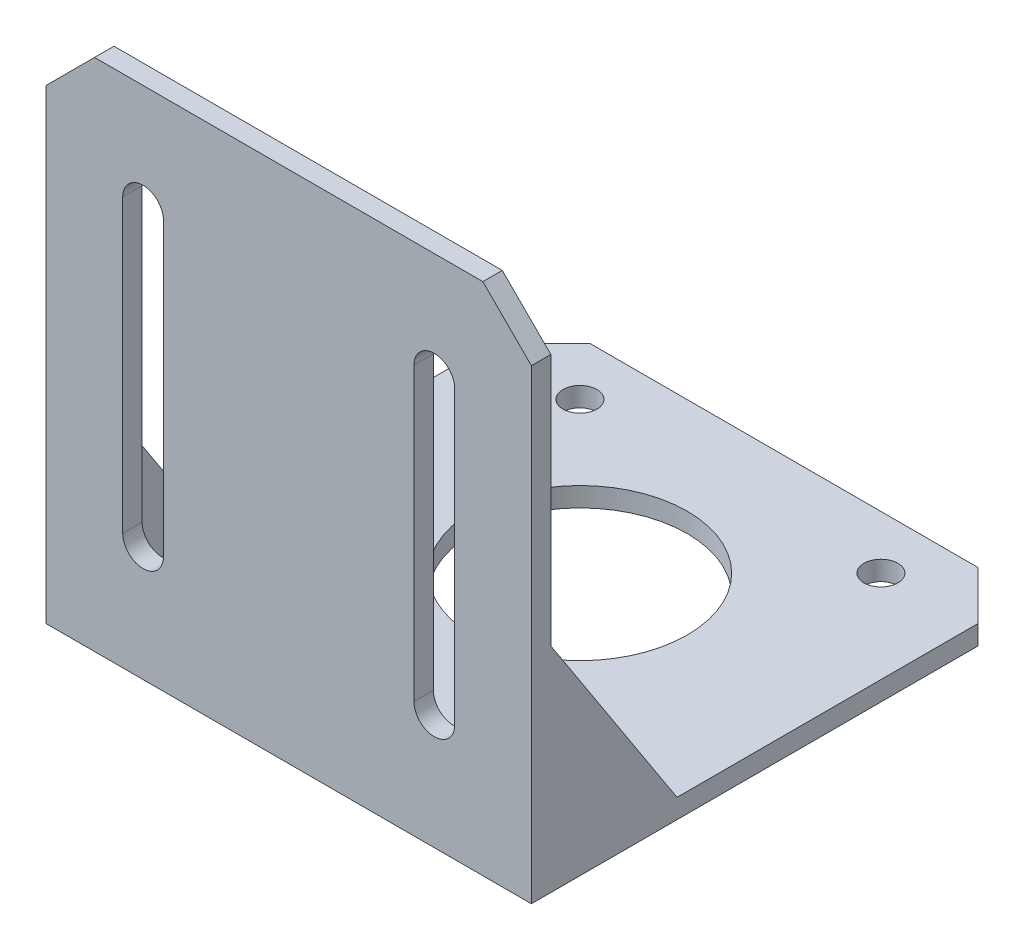
ISO-10303-21;
HEADER;
FILE_DESCRIPTION(('STEP AP214'),'2;1');
FILE_NAME('part.step','',(''),(''),'','','');
FILE_SCHEMA(('AUTOMOTIVE_DESIGN { 1 0 10303 214 1 1 1 1 }'));
ENDSEC;
DATA;
#1=APPLICATION_CONTEXT('core data for automotive mechanical design processes');
#2=APPLICATION_PROTOCOL_DEFINITION('international standard','automotive_design',2000,#1);
#3=PRODUCT_CONTEXT('',#1,'mechanical');
#4=PRODUCT('Part','Part','',(#3));
#5=PRODUCT_RELATED_PRODUCT_CATEGORY('part','',(#4));
#6=PRODUCT_DEFINITION_FORMATION('','',#4);
#7=PRODUCT_DEFINITION_CONTEXT('part definition',#1,'design');
#8=PRODUCT_DEFINITION('design','',#6,#7);
#9=PRODUCT_DEFINITION_SHAPE('','',#8);
#10=(LENGTH_UNIT() NAMED_UNIT(*) SI_UNIT(.MILLI.,.METRE.));
#11=(NAMED_UNIT(*) PLANE_ANGLE_UNIT() SI_UNIT($,.RADIAN.));
#12=(NAMED_UNIT(*) SI_UNIT($,.STERADIAN.) SOLID_ANGLE_UNIT());
#13=UNCERTAINTY_MEASURE_WITH_UNIT(LENGTH_MEASURE(1.E-05),#10,'distance_accuracy_value','');
#14=(GEOMETRIC_REPRESENTATION_CONTEXT(3) GLOBAL_UNCERTAINTY_ASSIGNED_CONTEXT((#13)) GLOBAL_UNIT_ASSIGNED_CONTEXT((#10,
#11,#12)) REPRESENTATION_CONTEXT('',''));
#15=CARTESIAN_POINT('',(0.,0.,0.));
#16=DIRECTION('',(0.,0.,1.));
#17=DIRECTION('',(1.,0.,0.));
#18=AXIS2_PLACEMENT_3D('',#15,#16,#17);
#19=CARTESIAN_POINT('',(-25.,53.,30.));
#20=DIRECTION('',(0.,0.,-1.));
#21=DIRECTION('',(-1.,0.,0.));
#22=AXIS2_PLACEMENT_3D('',#19,#20,#21);
#23=PLANE('',#22);
#24=DIRECTION('',(0.,-1.,0.));
#25=VECTOR('',#24,1.);
#26=CARTESIAN_POINT('',(-25.,53.,30.));
#27=LINE('',#26,#25);
#28=CARTESIAN_POINT('',(-25.,48.,30.));
#29=VERTEX_POINT('',#28);
#30=CARTESIAN_POINT('',(-25.,0.,30.));
#31=VERTEX_POINT('',#30);
#32=EDGE_CURVE('E287',#29,#31,#27,.T.);
#33=ORIENTED_EDGE('',*,*,#32,.T.);
#34=DIRECTION('',(1.,0.,0.));
#35=VECTOR('',#34,1.);
#36=CARTESIAN_POINT('',(-25.,0.,30.));
#37=LINE('',#36,#35);
#38=CARTESIAN_POINT('',(25.,0.,30.));
#39=VERTEX_POINT('',#38);
#40=EDGE_CURVE('E265',#31,#39,#37,.T.);
#41=ORIENTED_EDGE('',*,*,#40,.T.);
#42=DIRECTION('',(0.,-1.,0.));
#43=VECTOR('',#42,1.);
#44=CARTESIAN_POINT('',(25.,53.,30.));
#45=LINE('',#44,#43);
#46=CARTESIAN_POINT('',(25.,48.,30.));
#47=VERTEX_POINT('',#46);
#48=EDGE_CURVE('E284',#47,#39,#45,.T.);
#49=ORIENTED_EDGE('',*,*,#48,.F.);
#50=DIRECTION('',(-0.707106781186547,0.707106781186549,0.));
#51=VECTOR('',#50,1.);
#52=CARTESIAN_POINT('',(20.,53.,30.));
#53=LINE('',#52,#51);
#54=CARTESIAN_POINT('',(20.,53.,30.));
#55=VERTEX_POINT('',#54);
#56=EDGE_CURVE('E365',#47,#55,#53,.T.);
#57=ORIENTED_EDGE('',*,*,#56,.T.);
#58=DIRECTION('',(1.,0.,0.));
#59=VECTOR('',#58,1.);
#60=CARTESIAN_POINT('',(-25.,53.,30.));
#61=LINE('',#60,#59);
#62=CARTESIAN_POINT('',(-20.,53.,30.));
#63=VERTEX_POINT('',#62);
#64=EDGE_CURVE('E273',#63,#55,#61,.T.);
#65=ORIENTED_EDGE('',*,*,#64,.F.);
#66=DIRECTION('',(-0.707106781186547,-0.707106781186549,0.));
#67=VECTOR('',#66,1.);
#68=CARTESIAN_POINT('',(-20.,53.,30.));
#69=LINE('',#68,#67);
#70=EDGE_CURVE('E351',#63,#29,#69,.T.);
#71=ORIENTED_EDGE('',*,*,#70,.T.);
#72=EDGE_LOOP('',(#33,#41,#49,#57,#65,#71));
#73=FACE_BOUND('',#72,.T.);
#74=CARTESIAN_POINT('',(15.,42.,30.));
#75=DIRECTION('',(0.,0.,-1.));
#76=DIRECTION('',(-1.,0.,0.));
#77=AXIS2_PLACEMENT_3D('',#74,#75,#76);
#78=CIRCLE('',#77,2.1);
#79=CARTESIAN_POINT('',(12.9,42.,30.));
#80=VERTEX_POINT('',#79);
#81=CARTESIAN_POINT('',(17.1,42.,30.));
#82=VERTEX_POINT('',#81);
#83=EDGE_CURVE('E258',#80,#82,#78,.T.);
#84=ORIENTED_EDGE('',*,*,#83,.T.);
#85=DIRECTION('',(0.,-1.,0.));
#86=VECTOR('',#85,1.);
#87=CARTESIAN_POINT('',(17.1,0.,30.));
#88=LINE('',#87,#86);
#89=CARTESIAN_POINT('',(17.1,12.,30.));
#90=VERTEX_POINT('',#89);
#91=EDGE_CURVE('E242',#82,#90,#88,.T.);
#92=ORIENTED_EDGE('',*,*,#91,.T.);
#93=CARTESIAN_POINT('',(15.,12.,30.));
#94=DIRECTION('',(0.,0.,-1.));
#95=DIRECTION('',(-1.,0.,0.));
#96=AXIS2_PLACEMENT_3D('',#93,#94,#95);
#97=CIRCLE('',#96,2.1);
#98=CARTESIAN_POINT('',(12.9,12.,30.));
#99=VERTEX_POINT('',#98);
#100=EDGE_CURVE('E252',#90,#99,#97,.T.);
#101=ORIENTED_EDGE('',*,*,#100,.T.);
#102=DIRECTION('',(0.,-1.,0.));
#103=VECTOR('',#102,1.);
#104=CARTESIAN_POINT('',(12.9,0.,30.));
#105=LINE('',#104,#103);
#106=EDGE_CURVE('E255',#80,#99,#105,.T.);
#107=ORIENTED_EDGE('',*,*,#106,.F.);
#108=EDGE_LOOP('',(#84,#92,#101,#107));
#109=FACE_BOUND('',#108,.T.);
#110=CARTESIAN_POINT('',(-15.,12.,30.));
#111=DIRECTION('',(0.,0.,-1.));
#112=DIRECTION('',(-1.,0.,0.));
#113=AXIS2_PLACEMENT_3D('',#110,#111,#112);
#114=CIRCLE('',#113,2.1);
#115=CARTESIAN_POINT('',(-17.1,12.,30.));
#116=VERTEX_POINT('',#115);
#117=CARTESIAN_POINT('',(-12.9,12.,30.));
#118=VERTEX_POINT('',#117);
#119=EDGE_CURVE('E228',#116,#118,#114,.F.);
#120=ORIENTED_EDGE('',*,*,#119,.F.);
#121=DIRECTION('',(0.,-1.,0.));
#122=VECTOR('',#121,1.);
#123=CARTESIAN_POINT('',(-17.1,0.,30.));
#124=LINE('',#123,#122);
#125=CARTESIAN_POINT('',(-17.1,42.,30.));
#126=VERTEX_POINT('',#125);
#127=EDGE_CURVE('E230',#126,#116,#124,.T.);
#128=ORIENTED_EDGE('',*,*,#127,.F.);
#129=CARTESIAN_POINT('',(-15.,42.,30.));
#130=DIRECTION('',(0.,0.,-1.));
#131=DIRECTION('',(-1.,0.,0.));
#132=AXIS2_PLACEMENT_3D('',#129,#130,#131);
#133=CIRCLE('',#132,2.1);
#134=CARTESIAN_POINT('',(-12.9,42.,30.));
#135=VERTEX_POINT('',#134);
#136=EDGE_CURVE('E232',#135,#126,#133,.F.);
#137=ORIENTED_EDGE('',*,*,#136,.F.);
#138=DIRECTION('',(0.,-1.,0.));
#139=VECTOR('',#138,1.);
#140=CARTESIAN_POINT('',(-12.9,0.,30.));
#141=LINE('',#140,#139);
#142=EDGE_CURVE('E235',#135,#118,#141,.T.);
#143=ORIENTED_EDGE('',*,*,#142,.T.);
#144=EDGE_LOOP('',(#120,#128,#137,#143));
#145=FACE_BOUND('',#144,.T.);
#146=ADVANCED_FACE('F36',(#73,#109,#145),#23,.F.);
#147=CARTESIAN_POINT('',(-25.,53.,28.));
#148=DIRECTION('',(0.,0.,1.));
#149=DIRECTION('',(1.,0.,0.));
#150=AXIS2_PLACEMENT_3D('',#147,#148,#149);
#151=PLANE('',#150);
#152=DIRECTION('',(0.,1.,0.));
#153=VECTOR('',#152,1.);
#154=CARTESIAN_POINT('',(23.,53.,28.));
#155=LINE('',#154,#153);
#156=CARTESIAN_POINT('',(23.,4.,28.));
#157=VERTEX_POINT('',#156);
#158=CARTESIAN_POINT('',(23.,22.,28.));
#159=VERTEX_POINT('',#158);
#160=EDGE_CURVE('E226',#157,#159,#155,.T.);
#161=ORIENTED_EDGE('',*,*,#160,.F.);
#162=DIRECTION('',(1.,0.,0.));
#163=VECTOR('',#162,1.);
#164=CARTESIAN_POINT('',(-23.,4.,28.));
#165=LINE('',#164,#163);
#166=CARTESIAN_POINT('',(-23.,4.,28.));
#167=VERTEX_POINT('',#166);
#168=EDGE_CURVE('E44',#157,#167,#165,.F.);
#169=ORIENTED_EDGE('',*,*,#168,.T.);
#170=DIRECTION('',(0.,-1.,0.));
#171=VECTOR('',#170,1.);
#172=CARTESIAN_POINT('',(-23.,53.,28.));
#173=LINE('',#172,#171);
#174=CARTESIAN_POINT('',(-23.,22.,28.));
#175=VERTEX_POINT('',#174);
#176=EDGE_CURVE('E219',#175,#167,#173,.T.);
#177=ORIENTED_EDGE('',*,*,#176,.F.);
#178=DIRECTION('',(-1.,0.,0.));
#179=VECTOR('',#178,1.);
#180=CARTESIAN_POINT('',(-25.,22.,28.));
#181=LINE('',#180,#179);
#182=CARTESIAN_POINT('',(-25.,22.,28.));
#183=VERTEX_POINT('',#182);
#184=EDGE_CURVE('E447',#175,#183,#181,.T.);
#185=ORIENTED_EDGE('',*,*,#184,.T.);
#186=DIRECTION('',(0.,-1.,0.));
#187=VECTOR('',#186,1.);
#188=CARTESIAN_POINT('',(-25.,53.,28.));
#189=LINE('',#188,#187);
#190=CARTESIAN_POINT('',(-25.,48.,28.));
#191=VERTEX_POINT('',#190);
#192=EDGE_CURVE('E278',#191,#183,#189,.T.);
#193=ORIENTED_EDGE('',*,*,#192,.F.);
#194=DIRECTION('',(0.707106781186547,0.707106781186549,0.));
#195=VECTOR('',#194,1.);
#196=CARTESIAN_POINT('',(-20.,53.,28.));
#197=LINE('',#196,#195);
#198=CARTESIAN_POINT('',(-20.,53.,28.));
#199=VERTEX_POINT('',#198);
#200=EDGE_CURVE('E355',#191,#199,#197,.T.);
#201=ORIENTED_EDGE('',*,*,#200,.T.);
#202=DIRECTION('',(-1.,0.,0.));
#203=VECTOR('',#202,1.);
#204=CARTESIAN_POINT('',(-25.,53.,28.));
#205=LINE('',#204,#203);
#206=CARTESIAN_POINT('',(20.,53.,28.));
#207=VERTEX_POINT('',#206);
#208=EDGE_CURVE('E276',#207,#199,#205,.T.);
#209=ORIENTED_EDGE('',*,*,#208,.F.);
#210=DIRECTION('',(0.707106781186547,-0.707106781186549,0.));
#211=VECTOR('',#210,1.);
#212=CARTESIAN_POINT('',(20.,53.,28.));
#213=LINE('',#212,#211);
#214=CARTESIAN_POINT('',(25.,48.,28.));
#215=VERTEX_POINT('',#214);
#216=EDGE_CURVE('E361',#207,#215,#213,.T.);
#217=ORIENTED_EDGE('',*,*,#216,.T.);
#218=DIRECTION('',(0.,-1.,0.));
#219=VECTOR('',#218,1.);
#220=CARTESIAN_POINT('',(25.,53.,28.));
#221=LINE('',#220,#219);
#222=CARTESIAN_POINT('',(25.,22.,28.));
#223=VERTEX_POINT('',#222);
#224=EDGE_CURVE('E282',#215,#223,#221,.T.);
#225=ORIENTED_EDGE('',*,*,#224,.T.);
#226=DIRECTION('',(1.,0.,0.));
#227=VECTOR('',#226,1.);
#228=CARTESIAN_POINT('',(-25.,22.,28.));
#229=LINE('',#228,#227);
#230=EDGE_CURVE('E212',#223,#159,#229,.F.);
#231=ORIENTED_EDGE('',*,*,#230,.T.);
#232=EDGE_LOOP('',(#161,#169,#177,#185,#193,#201,#209,#217,#225,#231));
#233=FACE_BOUND('',#232,.T.);
#234=CARTESIAN_POINT('',(15.,12.,28.));
#235=DIRECTION('',(0.,0.,1.));
#236=DIRECTION('',(1.,0.,0.));
#237=AXIS2_PLACEMENT_3D('',#234,#235,#236);
#238=CIRCLE('',#237,2.1);
#239=CARTESIAN_POINT('',(12.9,12.,28.));
#240=VERTEX_POINT('',#239);
#241=CARTESIAN_POINT('',(17.1,12.,28.));
#242=VERTEX_POINT('',#241);
#243=EDGE_CURVE('E367',#240,#242,#238,.T.);
#244=ORIENTED_EDGE('',*,*,#243,.T.);
#245=DIRECTION('',(0.,1.,0.));
#246=VECTOR('',#245,1.);
#247=CARTESIAN_POINT('',(17.1,53.,28.));
#248=LINE('',#247,#246);
#249=CARTESIAN_POINT('',(17.1,42.,28.));
#250=VERTEX_POINT('',#249);
#251=EDGE_CURVE('E375',#242,#250,#248,.T.);
#252=ORIENTED_EDGE('',*,*,#251,.T.);
#253=CARTESIAN_POINT('',(15.,42.,28.));
#254=DIRECTION('',(0.,0.,1.));
#255=DIRECTION('',(1.,0.,0.));
#256=AXIS2_PLACEMENT_3D('',#253,#254,#255);
#257=CIRCLE('',#256,2.1);
#258=CARTESIAN_POINT('',(12.9,42.,28.));
#259=VERTEX_POINT('',#258);
#260=EDGE_CURVE('E372',#250,#259,#257,.T.);
#261=ORIENTED_EDGE('',*,*,#260,.T.);
#262=DIRECTION('',(0.,1.,0.));
#263=VECTOR('',#262,1.);
#264=CARTESIAN_POINT('',(12.9,53.,28.));
#265=LINE('',#264,#263);
#266=EDGE_CURVE('E370',#240,#259,#265,.T.);
#267=ORIENTED_EDGE('',*,*,#266,.F.);
#268=EDGE_LOOP('',(#244,#252,#261,#267));
#269=FACE_BOUND('',#268,.T.);
#270=CARTESIAN_POINT('',(-15.,12.,28.));
#271=DIRECTION('',(0.,0.,1.));
#272=DIRECTION('',(1.,0.,0.));
#273=AXIS2_PLACEMENT_3D('',#270,#271,#272);
#274=CIRCLE('',#273,2.1);
#275=CARTESIAN_POINT('',(-12.9,12.,28.));
#276=VERTEX_POINT('',#275);
#277=CARTESIAN_POINT('',(-17.1,12.,28.));
#278=VERTEX_POINT('',#277);
#279=EDGE_CURVE('E385',#276,#278,#274,.F.);
#280=ORIENTED_EDGE('',*,*,#279,.F.);
#281=DIRECTION('',(0.,1.,0.));
#282=VECTOR('',#281,1.);
#283=CARTESIAN_POINT('',(-12.9,53.,28.));
#284=LINE('',#283,#282);
#285=CARTESIAN_POINT('',(-12.9,42.,28.));
#286=VERTEX_POINT('',#285);
#287=EDGE_CURVE('E382',#276,#286,#284,.T.);
#288=ORIENTED_EDGE('',*,*,#287,.T.);
#289=CARTESIAN_POINT('',(-15.,42.,28.));
#290=DIRECTION('',(0.,0.,1.));
#291=DIRECTION('',(1.,0.,0.));
#292=AXIS2_PLACEMENT_3D('',#289,#290,#291);
#293=CIRCLE('',#292,2.1);
#294=CARTESIAN_POINT('',(-17.1,42.,28.));
#295=VERTEX_POINT('',#294);
#296=EDGE_CURVE('E380',#295,#286,#293,.F.);
#297=ORIENTED_EDGE('',*,*,#296,.F.);
#298=DIRECTION('',(0.,1.,0.));
#299=VECTOR('',#298,1.);
#300=CARTESIAN_POINT('',(-17.1,53.,28.));
#301=LINE('',#300,#299);
#302=EDGE_CURVE('E378',#278,#295,#301,.T.);
#303=ORIENTED_EDGE('',*,*,#302,.F.);
#304=EDGE_LOOP('',(#280,#288,#297,#303));
#305=FACE_BOUND('',#304,.T.);
#306=ADVANCED_FACE('F396',(#233,#269,#305),#151,.F.);
#307=CARTESIAN_POINT('',(0.,2.,0.));
#308=DIRECTION('',(0.,-1.,0.));
#309=DIRECTION('',(0.,0.,-1.));
#310=AXIS2_PLACEMENT_3D('',#307,#308,#309);
#311=PLANE('',#310);
#312=DIRECTION('',(0.,0.,-1.));
#313=VECTOR('',#312,1.);
#314=CARTESIAN_POINT('',(-23.,2.,0.));
#315=LINE('',#314,#313);
#316=CARTESIAN_POINT('',(-23.,2.,26.));
#317=VERTEX_POINT('',#316);
#318=CARTESIAN_POINT('',(-23.,2.,15.));
#319=VERTEX_POINT('',#318);
#320=EDGE_CURVE('E392',#317,#319,#315,.T.);
#321=ORIENTED_EDGE('',*,*,#320,.F.);
#322=DIRECTION('',(1.,0.,0.));
#323=VECTOR('',#322,1.);
#324=CARTESIAN_POINT('',(23.,2.,26.));
#325=LINE('',#324,#323);
#326=CARTESIAN_POINT('',(23.,2.,26.));
#327=VERTEX_POINT('',#326);
#328=EDGE_CURVE('E388',#317,#327,#325,.T.);
#329=ORIENTED_EDGE('',*,*,#328,.T.);
#330=DIRECTION('',(0.,0.,1.));
#331=VECTOR('',#330,1.);
#332=CARTESIAN_POINT('',(23.,2.,0.));
#333=LINE('',#332,#331);
#334=CARTESIAN_POINT('',(23.,2.,15.));
#335=VERTEX_POINT('',#334);
#336=EDGE_CURVE('E208',#335,#327,#333,.T.);
#337=ORIENTED_EDGE('',*,*,#336,.F.);
#338=DIRECTION('',(-1.,0.,0.));
#339=VECTOR('',#338,1.);
#340=CARTESIAN_POINT('',(0.,2.,15.));
#341=LINE('',#340,#339);
#342=CARTESIAN_POINT('',(25.,1.99999999999999,15.));
#343=VERTEX_POINT('',#342);
#344=EDGE_CURVE('E203',#335,#343,#341,.F.);
#345=ORIENTED_EDGE('',*,*,#344,.T.);
#346=DIRECTION('',(0.,0.,-1.));
#347=VECTOR('',#346,1.);
#348=CARTESIAN_POINT('',(25.,2.,28.));
#349=LINE('',#348,#347);
#350=CARTESIAN_POINT('',(25.,2.,-16.));
#351=VERTEX_POINT('',#350);
#352=EDGE_CURVE('E189',#343,#351,#349,.T.);
#353=ORIENTED_EDGE('',*,*,#352,.T.);
#354=DIRECTION('',(0.707106781186546,0.,0.707106781186549));
#355=VECTOR('',#354,1.);
#356=CARTESIAN_POINT('',(20.,2.,-21.));
#357=LINE('',#356,#355);
#358=CARTESIAN_POINT('',(20.,2.,-21.));
#359=VERTEX_POINT('',#358);
#360=EDGE_CURVE('E343',#351,#359,#357,.F.);
#361=ORIENTED_EDGE('',*,*,#360,.T.);
#362=DIRECTION('',(-1.,0.,0.));
#363=VECTOR('',#362,1.);
#364=CARTESIAN_POINT('',(-25.,2.,-21.));
#365=LINE('',#364,#363);
#366=CARTESIAN_POINT('',(-20.,2.,-21.));
#367=VERTEX_POINT('',#366);
#368=EDGE_CURVE('E199',#359,#367,#365,.T.);
#369=ORIENTED_EDGE('',*,*,#368,.T.);
#370=DIRECTION('',(0.707106781186548,0.,-0.707106781186547));
#371=VECTOR('',#370,1.);
#372=CARTESIAN_POINT('',(-25.,2.,-16.));
#373=LINE('',#372,#371);
#374=CARTESIAN_POINT('',(-25.,2.,-16.));
#375=VERTEX_POINT('',#374);
#376=EDGE_CURVE('E341',#367,#375,#373,.F.);
#377=ORIENTED_EDGE('',*,*,#376,.T.);
#378=DIRECTION('',(0.,0.,1.));
#379=VECTOR('',#378,1.);
#380=CARTESIAN_POINT('',(-25.,2.,28.));
#381=LINE('',#380,#379);
#382=CARTESIAN_POINT('',(-25.,2.,15.));
#383=VERTEX_POINT('',#382);
#384=EDGE_CURVE('E322',#375,#383,#381,.T.);
#385=ORIENTED_EDGE('',*,*,#384,.T.);
#386=DIRECTION('',(1.,0.,0.));
#387=VECTOR('',#386,1.);
#388=CARTESIAN_POINT('',(0.,2.,15.));
#389=LINE('',#388,#387);
#390=EDGE_CURVE('E444',#383,#319,#389,.T.);
#391=ORIENTED_EDGE('',*,*,#390,.T.);
#392=EDGE_LOOP('',(#321,#329,#337,#345,#353,#361,#369,#377,#385,#391));
#393=FACE_BOUND('',#392,.T.);
#394=CARTESIAN_POINT('',(0.,2.,0.));
#395=DIRECTION('',(0.,1.,0.));
#396=DIRECTION('',(0.,0.,1.));
#397=AXIS2_PLACEMENT_3D('',#394,#395,#396);
#398=CIRCLE('',#397,11.05);
#399=CARTESIAN_POINT('',(0.,2.,11.05));
#400=VERTEX_POINT('',#399);
#401=EDGE_CURVE('E314',#400,#400,#398,.T.);
#402=ORIENTED_EDGE('',*,*,#401,.F.);
#403=EDGE_LOOP('',(#402));
#404=FACE_BOUND('',#403,.T.);
#405=CARTESIAN_POINT('',(15.5,2.,-15.5));
#406=DIRECTION('',(0.,1.,0.));
#407=DIRECTION('',(0.,0.,1.));
#408=AXIS2_PLACEMENT_3D('',#405,#406,#407);
#409=CIRCLE('',#408,1.75);
#410=CARTESIAN_POINT('',(15.5,2.,-13.75));
#411=VERTEX_POINT('',#410);
#412=EDGE_CURVE('E308',#411,#411,#409,.T.);
#413=ORIENTED_EDGE('',*,*,#412,.F.);
#414=EDGE_LOOP('',(#413));
#415=FACE_BOUND('',#414,.T.);
#416=CARTESIAN_POINT('',(15.5,2.,15.5));
#417=DIRECTION('',(0.,1.,0.));
#418=DIRECTION('',(0.,0.,-1.));
#419=AXIS2_PLACEMENT_3D('',#416,#417,#418);
#420=CIRCLE('',#419,1.75);
#421=CARTESIAN_POINT('',(15.5,2.,13.75));
#422=VERTEX_POINT('',#421);
#423=EDGE_CURVE('E302',#422,#422,#420,.T.);
#424=ORIENTED_EDGE('',*,*,#423,.F.);
#425=EDGE_LOOP('',(#424));
#426=FACE_BOUND('',#425,.T.);
#427=CARTESIAN_POINT('',(-15.5,2.,15.5));
#428=DIRECTION('',(0.,1.,0.));
#429=DIRECTION('',(0.,0.,1.));
#430=AXIS2_PLACEMENT_3D('',#427,#428,#429);
#431=CIRCLE('',#430,1.75);
#432=CARTESIAN_POINT('',(-15.5,2.,17.25));
#433=VERTEX_POINT('',#432);
#434=EDGE_CURVE('E296',#433,#433,#431,.T.);
#435=ORIENTED_EDGE('',*,*,#434,.F.);
#436=EDGE_LOOP('',(#435));
#437=FACE_BOUND('',#436,.T.);
#438=CARTESIAN_POINT('',(-15.5,2.,-15.5));
#439=DIRECTION('',(0.,1.,0.));
#440=DIRECTION('',(0.,0.,-1.));
#441=AXIS2_PLACEMENT_3D('',#438,#439,#440);
#442=CIRCLE('',#441,1.75);
#443=CARTESIAN_POINT('',(-15.5,2.,-17.25));
#444=VERTEX_POINT('',#443);
#445=EDGE_CURVE('E290',#444,#444,#442,.T.);
#446=ORIENTED_EDGE('',*,*,#445,.F.);
#447=EDGE_LOOP('',(#446));
#448=FACE_BOUND('',#447,.T.);
#449=ADVANCED_FACE('F205',(#393,#404,#415,#426,#437,#448),#311,.F.);
#450=CARTESIAN_POINT('',(0.,0.,0.));
#451=DIRECTION('',(0.,-1.,0.));
#452=DIRECTION('',(0.,0.,-1.));
#453=AXIS2_PLACEMENT_3D('',#450,#451,#452);
#454=PLANE('',#453);
#455=ORIENTED_EDGE('',*,*,#40,.F.);
#456=DIRECTION('',(0.,0.,1.));
#457=VECTOR('',#456,1.);
#458=CARTESIAN_POINT('',(-25.,0.,28.));
#459=LINE('',#458,#457);
#460=CARTESIAN_POINT('',(-25.,0.,-16.));
#461=VERTEX_POINT('',#460);
#462=EDGE_CURVE('E200',#461,#31,#459,.T.);
#463=ORIENTED_EDGE('',*,*,#462,.F.);
#464=DIRECTION('',(-0.707106781186548,0.,0.707106781186547));
#465=VECTOR('',#464,1.);
#466=CARTESIAN_POINT('',(-20.5,0.,-20.5));
#467=LINE('',#466,#465);
#468=CARTESIAN_POINT('',(-20.,0.,-21.));
#469=VERTEX_POINT('',#468);
#470=EDGE_CURVE('E335',#461,#469,#467,.F.);
#471=ORIENTED_EDGE('',*,*,#470,.T.);
#472=DIRECTION('',(-1.,0.,0.));
#473=VECTOR('',#472,1.);
#474=CARTESIAN_POINT('',(-25.,0.,-21.));
#475=LINE('',#474,#473);
#476=CARTESIAN_POINT('',(20.,0.,-21.));
#477=VERTEX_POINT('',#476);
#478=EDGE_CURVE('E326',#477,#469,#475,.T.);
#479=ORIENTED_EDGE('',*,*,#478,.F.);
#480=DIRECTION('',(-0.707106781186546,0.,-0.707106781186549));
#481=VECTOR('',#480,1.);
#482=CARTESIAN_POINT('',(20.5,0.,-20.5));
#483=LINE('',#482,#481);
#484=CARTESIAN_POINT('',(25.,0.,-16.));
#485=VERTEX_POINT('',#484);
#486=EDGE_CURVE('E337',#477,#485,#483,.F.);
#487=ORIENTED_EDGE('',*,*,#486,.T.);
#488=DIRECTION('',(0.,0.,-1.));
#489=VECTOR('',#488,1.);
#490=CARTESIAN_POINT('',(25.,0.,28.));
#491=LINE('',#490,#489);
#492=EDGE_CURVE('E317',#39,#485,#491,.T.);
#493=ORIENTED_EDGE('',*,*,#492,.F.);
#494=EDGE_LOOP('',(#455,#463,#471,#479,#487,#493));
#495=FACE_BOUND('',#494,.T.);
#496=CARTESIAN_POINT('',(-15.5,0.,15.5));
#497=DIRECTION('',(0.,1.,0.));
#498=DIRECTION('',(0.,0.,1.));
#499=AXIS2_PLACEMENT_3D('',#496,#497,#498);
#500=CIRCLE('',#499,1.75);
#501=CARTESIAN_POINT('',(-15.5,0.,17.25));
#502=VERTEX_POINT('',#501);
#503=EDGE_CURVE('E293',#502,#502,#500,.T.);
#504=ORIENTED_EDGE('',*,*,#503,.T.);
#505=EDGE_LOOP('',(#504));
#506=FACE_BOUND('',#505,.T.);
#507=CARTESIAN_POINT('',(15.5,0.,-15.5));
#508=DIRECTION('',(0.,1.,0.));
#509=DIRECTION('',(0.,0.,1.));
#510=AXIS2_PLACEMENT_3D('',#507,#508,#509);
#511=CIRCLE('',#510,1.75);
#512=CARTESIAN_POINT('',(15.5,0.,-13.75));
#513=VERTEX_POINT('',#512);
#514=EDGE_CURVE('E305',#513,#513,#511,.T.);
#515=ORIENTED_EDGE('',*,*,#514,.T.);
#516=EDGE_LOOP('',(#515));
#517=FACE_BOUND('',#516,.T.);
#518=CARTESIAN_POINT('',(0.,0.,0.));
#519=DIRECTION('',(0.,1.,0.));
#520=DIRECTION('',(0.,0.,1.));
#521=AXIS2_PLACEMENT_3D('',#518,#519,#520);
#522=CIRCLE('',#521,11.05);
#523=CARTESIAN_POINT('',(0.,0.,11.05));
#524=VERTEX_POINT('',#523);
#525=EDGE_CURVE('E311',#524,#524,#522,.T.);
#526=ORIENTED_EDGE('',*,*,#525,.T.);
#527=EDGE_LOOP('',(#526));
#528=FACE_BOUND('',#527,.T.);
#529=CARTESIAN_POINT('',(15.5,0.,15.5));
#530=DIRECTION('',(0.,1.,0.));
#531=DIRECTION('',(0.,0.,-1.));
#532=AXIS2_PLACEMENT_3D('',#529,#530,#531);
#533=CIRCLE('',#532,1.75);
#534=CARTESIAN_POINT('',(15.5,0.,13.75));
#535=VERTEX_POINT('',#534);
#536=EDGE_CURVE('E299',#535,#535,#533,.T.);
#537=ORIENTED_EDGE('',*,*,#536,.T.);
#538=EDGE_LOOP('',(#537));
#539=FACE_BOUND('',#538,.T.);
#540=CARTESIAN_POINT('',(-15.5,0.,-15.5));
#541=DIRECTION('',(0.,1.,0.));
#542=DIRECTION('',(0.,0.,-1.));
#543=AXIS2_PLACEMENT_3D('',#540,#541,#542);
#544=CIRCLE('',#543,1.75);
#545=CARTESIAN_POINT('',(-15.5,0.,-17.25));
#546=VERTEX_POINT('',#545);
#547=EDGE_CURVE('E289',#546,#546,#544,.T.);
#548=ORIENTED_EDGE('',*,*,#547,.T.);
#549=EDGE_LOOP('',(#548));
#550=FACE_BOUND('',#549,.T.);
#551=ADVANCED_FACE('F425',(#495,#506,#517,#528,#539,#550),#454,.T.);
#552=CARTESIAN_POINT('',(25.,2.,28.));
#553=DIRECTION('',(-1.,0.,0.));
#554=DIRECTION('',(0.,0.,1.));
#555=AXIS2_PLACEMENT_3D('',#552,#553,#554);
#556=PLANE('',#555);
#557=ORIENTED_EDGE('',*,*,#352,.F.);
#558=DIRECTION('',(0.,-0.838443616300637,-0.544988350595414));
#559=VECTOR('',#558,1.);
#560=CARTESIAN_POINT('',(25.,22.,28.));
#561=LINE('',#560,#559);
#562=EDGE_CURVE('E194',#223,#343,#561,.T.);
#563=ORIENTED_EDGE('',*,*,#562,.F.);
#564=ORIENTED_EDGE('',*,*,#224,.F.);
#565=DIRECTION('',(0.,0.,1.));
#566=VECTOR('',#565,1.);
#567=CARTESIAN_POINT('',(25.,48.,30.));
#568=LINE('',#567,#566);
#569=EDGE_CURVE('E363',#215,#47,#568,.T.);
#570=ORIENTED_EDGE('',*,*,#569,.T.);
#571=ORIENTED_EDGE('',*,*,#48,.T.);
#572=ORIENTED_EDGE('',*,*,#492,.T.);
#573=DIRECTION('',(0.,1.,0.));
#574=VECTOR('',#573,1.);
#575=CARTESIAN_POINT('',(25.,2.,-16.));
#576=LINE('',#575,#574);
#577=EDGE_CURVE('E196',#485,#351,#576,.T.);
#578=ORIENTED_EDGE('',*,*,#577,.T.);
#579=EDGE_LOOP('',(#557,#563,#564,#570,#571,#572,#578));
#580=FACE_BOUND('',#579,.T.);
#581=ADVANCED_FACE('F191',(#580),#556,.F.);
#582=CARTESIAN_POINT('',(-25.,2.,-21.));
#583=DIRECTION('',(0.,0.,1.));
#584=DIRECTION('',(1.,0.,0.));
#585=AXIS2_PLACEMENT_3D('',#582,#583,#584);
#586=PLANE('',#585);
#587=ORIENTED_EDGE('',*,*,#368,.F.);
#588=DIRECTION('',(0.,-1.,0.));
#589=VECTOR('',#588,1.);
#590=CARTESIAN_POINT('',(20.,2.,-21.));
#591=LINE('',#590,#589);
#592=EDGE_CURVE('E332',#359,#477,#591,.T.);
#593=ORIENTED_EDGE('',*,*,#592,.T.);
#594=ORIENTED_EDGE('',*,*,#478,.T.);
#595=DIRECTION('',(0.,1.,0.));
#596=VECTOR('',#595,1.);
#597=CARTESIAN_POINT('',(-20.,2.,-21.));
#598=LINE('',#597,#596);
#599=EDGE_CURVE('E324',#469,#367,#598,.T.);
#600=ORIENTED_EDGE('',*,*,#599,.T.);
#601=EDGE_LOOP('',(#587,#593,#594,#600));
#602=FACE_BOUND('',#601,.T.);
#603=ADVANCED_FACE('F434',(#602),#586,.F.);
#604=CARTESIAN_POINT('',(-25.,2.,28.));
#605=DIRECTION('',(1.,0.,0.));
#606=DIRECTION('',(0.,0.,-1.));
#607=AXIS2_PLACEMENT_3D('',#604,#605,#606);
#608=PLANE('',#607);
#609=ORIENTED_EDGE('',*,*,#462,.T.);
#610=ORIENTED_EDGE('',*,*,#32,.F.);
#611=DIRECTION('',(0.,0.,-1.));
#612=VECTOR('',#611,1.);
#613=CARTESIAN_POINT('',(-25.,48.,28.));
#614=LINE('',#613,#612);
#615=EDGE_CURVE('E353',#29,#191,#614,.T.);
#616=ORIENTED_EDGE('',*,*,#615,.T.);
#617=ORIENTED_EDGE('',*,*,#192,.T.);
#618=DIRECTION('',(0.,-0.838443616300637,-0.544988350595414));
#619=VECTOR('',#618,1.);
#620=CARTESIAN_POINT('',(-25.,22.,28.));
#621=LINE('',#620,#619);
#622=EDGE_CURVE('E441',#183,#383,#621,.T.);
#623=ORIENTED_EDGE('',*,*,#622,.T.);
#624=ORIENTED_EDGE('',*,*,#384,.F.);
#625=DIRECTION('',(0.,-1.,0.));
#626=VECTOR('',#625,1.);
#627=CARTESIAN_POINT('',(-25.,2.,-16.));
#628=LINE('',#627,#626);
#629=EDGE_CURVE('E345',#375,#461,#628,.T.);
#630=ORIENTED_EDGE('',*,*,#629,.T.);
#631=EDGE_LOOP('',(#609,#610,#616,#617,#623,#624,#630));
#632=FACE_BOUND('',#631,.T.);
#633=ADVANCED_FACE('F417',(#632),#608,.F.);
#634=CARTESIAN_POINT('',(0.,2.,0.));
#635=DIRECTION('',(0.,-1.,0.));
#636=DIRECTION('',(0.,0.,-1.));
#637=AXIS2_PLACEMENT_3D('',#634,#635,#636);
#638=CYLINDRICAL_SURFACE('',#637,11.05);
#639=ORIENTED_EDGE('',*,*,#401,.T.);
#640=EDGE_LOOP('',(#639));
#641=FACE_BOUND('',#640,.T.);
#642=ORIENTED_EDGE('',*,*,#525,.F.);
#643=EDGE_LOOP('',(#642));
#644=FACE_BOUND('',#643,.T.);
#645=ADVANCED_FACE('F484',(#641,#644),#638,.F.);
#646=CARTESIAN_POINT('',(15.5,2.,-15.5));
#647=DIRECTION('',(0.,-1.,0.));
#648=DIRECTION('',(0.,0.,-1.));
#649=AXIS2_PLACEMENT_3D('',#646,#647,#648);
#650=CYLINDRICAL_SURFACE('',#649,1.75);
#651=ORIENTED_EDGE('',*,*,#412,.T.);
#652=EDGE_LOOP('',(#651));
#653=FACE_BOUND('',#652,.T.);
#654=ORIENTED_EDGE('',*,*,#514,.F.);
#655=EDGE_LOOP('',(#654));
#656=FACE_BOUND('',#655,.T.);
#657=ADVANCED_FACE('F480',(#653,#656),#650,.F.);
#658=CARTESIAN_POINT('',(15.5,2.,15.5));
#659=DIRECTION('',(0.,-1.,0.));
#660=DIRECTION('',(0.,0.,-1.));
#661=AXIS2_PLACEMENT_3D('',#658,#659,#660);
#662=CYLINDRICAL_SURFACE('',#661,1.75);
#663=ORIENTED_EDGE('',*,*,#423,.T.);
#664=EDGE_LOOP('',(#663));
#665=FACE_BOUND('',#664,.T.);
#666=ORIENTED_EDGE('',*,*,#536,.F.);
#667=EDGE_LOOP('',(#666));
#668=FACE_BOUND('',#667,.T.);
#669=ADVANCED_FACE('F476',(#665,#668),#662,.F.);
#670=CARTESIAN_POINT('',(-15.5,2.,15.5));
#671=DIRECTION('',(0.,-1.,0.));
#672=DIRECTION('',(0.,0.,-1.));
#673=AXIS2_PLACEMENT_3D('',#670,#671,#672);
#674=CYLINDRICAL_SURFACE('',#673,1.75);
#675=ORIENTED_EDGE('',*,*,#434,.T.);
#676=EDGE_LOOP('',(#675));
#677=FACE_BOUND('',#676,.T.);
#678=ORIENTED_EDGE('',*,*,#503,.F.);
#679=EDGE_LOOP('',(#678));
#680=FACE_BOUND('',#679,.T.);
#681=ADVANCED_FACE('F472',(#677,#680),#674,.F.);
#682=CARTESIAN_POINT('',(-15.5,2.,-15.5));
#683=DIRECTION('',(0.,-1.,0.));
#684=DIRECTION('',(0.,0.,-1.));
#685=AXIS2_PLACEMENT_3D('',#682,#683,#684);
#686=CYLINDRICAL_SURFACE('',#685,1.75);
#687=ORIENTED_EDGE('',*,*,#445,.T.);
#688=EDGE_LOOP('',(#687));
#689=FACE_BOUND('',#688,.T.);
#690=ORIENTED_EDGE('',*,*,#547,.F.);
#691=EDGE_LOOP('',(#690));
#692=FACE_BOUND('',#691,.T.);
#693=ADVANCED_FACE('F469',(#689,#692),#686,.F.);
#694=CARTESIAN_POINT('',(20.,2.,-21.));
#695=DIRECTION('',(-0.707106781186549,0.,0.707106781186546));
#696=DIRECTION('',(0.,-1.,0.));
#697=AXIS2_PLACEMENT_3D('',#694,#695,#696);
#698=PLANE('',#697);
#699=ORIENTED_EDGE('',*,*,#360,.F.);
#700=ORIENTED_EDGE('',*,*,#577,.F.);
#701=ORIENTED_EDGE('',*,*,#486,.F.);
#702=ORIENTED_EDGE('',*,*,#592,.F.);
#703=EDGE_LOOP('',(#699,#700,#701,#702));
#704=FACE_BOUND('',#703,.T.);
#705=ADVANCED_FACE('F430',(#704),#698,.F.);
#706=CARTESIAN_POINT('',(-25.,2.,-16.));
#707=DIRECTION('',(0.707106781186547,0.,0.707106781186548));
#708=DIRECTION('',(0.,-1.,0.));
#709=AXIS2_PLACEMENT_3D('',#706,#707,#708);
#710=PLANE('',#709);
#711=ORIENTED_EDGE('',*,*,#376,.F.);
#712=ORIENTED_EDGE('',*,*,#599,.F.);
#713=ORIENTED_EDGE('',*,*,#470,.F.);
#714=ORIENTED_EDGE('',*,*,#629,.F.);
#715=EDGE_LOOP('',(#711,#712,#713,#714));
#716=FACE_BOUND('',#715,.T.);
#717=ADVANCED_FACE('F437',(#716),#710,.F.);
#718=CARTESIAN_POINT('',(0.,53.,0.));
#719=DIRECTION('',(0.,1.,0.));
#720=DIRECTION('',(0.,0.,1.));
#721=AXIS2_PLACEMENT_3D('',#718,#719,#720);
#722=PLANE('',#721);
#723=ORIENTED_EDGE('',*,*,#64,.T.);
#724=DIRECTION('',(0.,0.,-1.));
#725=VECTOR('',#724,1.);
#726=CARTESIAN_POINT('',(20.,53.,28.));
#727=LINE('',#726,#725);
#728=EDGE_CURVE('E358',#55,#207,#727,.T.);
#729=ORIENTED_EDGE('',*,*,#728,.T.);
#730=ORIENTED_EDGE('',*,*,#208,.T.);
#731=DIRECTION('',(0.,0.,1.));
#732=VECTOR('',#731,1.);
#733=CARTESIAN_POINT('',(-20.,53.,30.));
#734=LINE('',#733,#732);
#735=EDGE_CURVE('E348',#199,#63,#734,.T.);
#736=ORIENTED_EDGE('',*,*,#735,.T.);
#737=EDGE_LOOP('',(#723,#729,#730,#736));
#738=FACE_BOUND('',#737,.T.);
#739=ADVANCED_FACE('F409',(#738),#722,.T.);
#740=CARTESIAN_POINT('',(-20.,53.,0.));
#741=DIRECTION('',(-0.707106781186548,0.707106781186546,0.));
#742=DIRECTION('',(0.,0.,-1.));
#743=AXIS2_PLACEMENT_3D('',#740,#741,#742);
#744=PLANE('',#743);
#745=ORIENTED_EDGE('',*,*,#200,.F.);
#746=ORIENTED_EDGE('',*,*,#615,.F.);
#747=ORIENTED_EDGE('',*,*,#70,.F.);
#748=ORIENTED_EDGE('',*,*,#735,.F.);
#749=EDGE_LOOP('',(#745,#746,#747,#748));
#750=FACE_BOUND('',#749,.T.);
#751=ADVANCED_FACE('F413',(#750),#744,.T.);
#752=CARTESIAN_POINT('',(20.,53.,0.));
#753=DIRECTION('',(0.707106781186548,0.707106781186546,0.));
#754=DIRECTION('',(0.,0.,1.));
#755=AXIS2_PLACEMENT_3D('',#752,#753,#754);
#756=PLANE('',#755);
#757=ORIENTED_EDGE('',*,*,#56,.F.);
#758=ORIENTED_EDGE('',*,*,#569,.F.);
#759=ORIENTED_EDGE('',*,*,#216,.F.);
#760=ORIENTED_EDGE('',*,*,#728,.F.);
#761=EDGE_LOOP('',(#757,#758,#759,#760));
#762=FACE_BOUND('',#761,.T.);
#763=ADVANCED_FACE('F403',(#762),#756,.T.);
#764=CARTESIAN_POINT('',(17.1,0.,30.));
#765=DIRECTION('',(1.,0.,0.));
#766=DIRECTION('',(0.,1.,0.));
#767=AXIS2_PLACEMENT_3D('',#764,#765,#766);
#768=PLANE('',#767);
#769=DIRECTION('',(0.,0.,-1.));
#770=VECTOR('',#769,1.);
#771=CARTESIAN_POINT('',(17.1,12.,30.));
#772=LINE('',#771,#770);
#773=EDGE_CURVE('E261',#90,#242,#772,.T.);
#774=ORIENTED_EDGE('',*,*,#773,.F.);
#775=ORIENTED_EDGE('',*,*,#91,.F.);
#776=DIRECTION('',(0.,0.,-1.));
#777=VECTOR('',#776,1.);
#778=CARTESIAN_POINT('',(17.1,42.,30.));
#779=LINE('',#778,#777);
#780=EDGE_CURVE('E262',#82,#250,#779,.T.);
#781=ORIENTED_EDGE('',*,*,#780,.T.);
#782=ORIENTED_EDGE('',*,*,#251,.F.);
#783=EDGE_LOOP('',(#774,#775,#781,#782));
#784=FACE_BOUND('',#783,.T.);
#785=ADVANCED_FACE('F505',(#784),#768,.F.);
#786=CARTESIAN_POINT('',(15.,42.,30.));
#787=DIRECTION('',(0.,0.,-1.));
#788=DIRECTION('',(-1.,0.,0.));
#789=AXIS2_PLACEMENT_3D('',#786,#787,#788);
#790=CYLINDRICAL_SURFACE('',#789,2.1);
#791=ORIENTED_EDGE('',*,*,#780,.F.);
#792=ORIENTED_EDGE('',*,*,#83,.F.);
#793=DIRECTION('',(0.,0.,-1.));
#794=VECTOR('',#793,1.);
#795=CARTESIAN_POINT('',(12.9,42.,30.));
#796=LINE('',#795,#794);
#797=EDGE_CURVE('E266',#80,#259,#796,.T.);
#798=ORIENTED_EDGE('',*,*,#797,.T.);
#799=ORIENTED_EDGE('',*,*,#260,.F.);
#800=EDGE_LOOP('',(#791,#792,#798,#799));
#801=FACE_BOUND('',#800,.T.);
#802=ADVANCED_FACE('F509',(#801),#790,.F.);
#803=CARTESIAN_POINT('',(12.9,0.,30.));
#804=DIRECTION('',(1.,0.,0.));
#805=DIRECTION('',(0.,1.,0.));
#806=AXIS2_PLACEMENT_3D('',#803,#804,#805);
#807=PLANE('',#806);
#808=ORIENTED_EDGE('',*,*,#266,.T.);
#809=ORIENTED_EDGE('',*,*,#797,.F.);
#810=ORIENTED_EDGE('',*,*,#106,.T.);
#811=DIRECTION('',(0.,0.,-1.));
#812=VECTOR('',#811,1.);
#813=CARTESIAN_POINT('',(12.9,12.,30.));
#814=LINE('',#813,#812);
#815=EDGE_CURVE('E269',#99,#240,#814,.T.);
#816=ORIENTED_EDGE('',*,*,#815,.T.);
#817=EDGE_LOOP('',(#808,#809,#810,#816));
#818=FACE_BOUND('',#817,.T.);
#819=ADVANCED_FACE('F515',(#818),#807,.T.);
#820=CARTESIAN_POINT('',(15.,12.,30.));
#821=DIRECTION('',(0.,0.,-1.));
#822=DIRECTION('',(-1.,0.,0.));
#823=AXIS2_PLACEMENT_3D('',#820,#821,#822);
#824=CYLINDRICAL_SURFACE('',#823,2.1);
#825=ORIENTED_EDGE('',*,*,#815,.F.);
#826=ORIENTED_EDGE('',*,*,#100,.F.);
#827=ORIENTED_EDGE('',*,*,#773,.T.);
#828=ORIENTED_EDGE('',*,*,#243,.F.);
#829=EDGE_LOOP('',(#825,#826,#827,#828));
#830=FACE_BOUND('',#829,.T.);
#831=ADVANCED_FACE('F519',(#830),#824,.F.);
#832=CARTESIAN_POINT('',(-15.,12.,30.));
#833=DIRECTION('',(0.,0.,-1.));
#834=DIRECTION('',(-1.,0.,0.));
#835=AXIS2_PLACEMENT_3D('',#832,#833,#834);
#836=CYLINDRICAL_SURFACE('',#835,2.1);
#837=ORIENTED_EDGE('',*,*,#279,.T.);
#838=DIRECTION('',(0.,0.,-1.));
#839=VECTOR('',#838,1.);
#840=CARTESIAN_POINT('',(-17.1,12.,30.));
#841=LINE('',#840,#839);
#842=EDGE_CURVE('E238',#116,#278,#841,.T.);
#843=ORIENTED_EDGE('',*,*,#842,.F.);
#844=ORIENTED_EDGE('',*,*,#119,.T.);
#845=DIRECTION('',(0.,0.,-1.));
#846=VECTOR('',#845,1.);
#847=CARTESIAN_POINT('',(-12.9,12.,30.));
#848=LINE('',#847,#846);
#849=EDGE_CURVE('E239',#118,#276,#848,.T.);
#850=ORIENTED_EDGE('',*,*,#849,.T.);
#851=EDGE_LOOP('',(#837,#843,#844,#850));
#852=FACE_BOUND('',#851,.T.);
#853=ADVANCED_FACE('F672',(#852),#836,.F.);
#854=CARTESIAN_POINT('',(-12.9,0.,30.));
#855=DIRECTION('',(1.,0.,0.));
#856=DIRECTION('',(0.,1.,0.));
#857=AXIS2_PLACEMENT_3D('',#854,#855,#856);
#858=PLANE('',#857);
#859=ORIENTED_EDGE('',*,*,#849,.F.);
#860=ORIENTED_EDGE('',*,*,#142,.F.);
#861=DIRECTION('',(0.,0.,-1.));
#862=VECTOR('',#861,1.);
#863=CARTESIAN_POINT('',(-12.9,42.,30.));
#864=LINE('',#863,#862);
#865=EDGE_CURVE('E243',#135,#286,#864,.T.);
#866=ORIENTED_EDGE('',*,*,#865,.T.);
#867=ORIENTED_EDGE('',*,*,#287,.F.);
#868=EDGE_LOOP('',(#859,#860,#866,#867));
#869=FACE_BOUND('',#868,.T.);
#870=ADVANCED_FACE('F680',(#869),#858,.F.);
#871=CARTESIAN_POINT('',(-15.,42.,30.));
#872=DIRECTION('',(0.,0.,-1.));
#873=DIRECTION('',(-1.,0.,0.));
#874=AXIS2_PLACEMENT_3D('',#871,#872,#873);
#875=CYLINDRICAL_SURFACE('',#874,2.1);
#876=ORIENTED_EDGE('',*,*,#296,.T.);
#877=ORIENTED_EDGE('',*,*,#865,.F.);
#878=ORIENTED_EDGE('',*,*,#136,.T.);
#879=DIRECTION('',(0.,0.,-1.));
#880=VECTOR('',#879,1.);
#881=CARTESIAN_POINT('',(-17.1,42.,30.));
#882=LINE('',#881,#880);
#883=EDGE_CURVE('E246',#126,#295,#882,.T.);
#884=ORIENTED_EDGE('',*,*,#883,.T.);
#885=EDGE_LOOP('',(#876,#877,#878,#884));
#886=FACE_BOUND('',#885,.T.);
#887=ADVANCED_FACE('F689',(#886),#875,.F.);
#888=CARTESIAN_POINT('',(-17.1,0.,30.));
#889=DIRECTION('',(1.,0.,0.));
#890=DIRECTION('',(0.,1.,0.));
#891=AXIS2_PLACEMENT_3D('',#888,#889,#890);
#892=PLANE('',#891);
#893=ORIENTED_EDGE('',*,*,#302,.T.);
#894=ORIENTED_EDGE('',*,*,#883,.F.);
#895=ORIENTED_EDGE('',*,*,#127,.T.);
#896=ORIENTED_EDGE('',*,*,#842,.T.);
#897=EDGE_LOOP('',(#893,#894,#895,#896));
#898=FACE_BOUND('',#897,.T.);
#899=ADVANCED_FACE('F622',(#898),#892,.T.);
#900=CARTESIAN_POINT('',(23.,26.5,4.5));
#901=DIRECTION('',(1.,0.,0.));
#902=DIRECTION('',(0.,0.,-1.));
#903=AXIS2_PLACEMENT_3D('',#900,#901,#902);
#904=PLANE('',#903);
#905=ORIENTED_EDGE('',*,*,#336,.T.);
#906=CARTESIAN_POINT('',(23.,4.,26.));
#907=DIRECTION('',(1.,0.,0.));
#908=DIRECTION('',(0.,0.,-1.));
#909=AXIS2_PLACEMENT_3D('',#906,#907,#908);
#910=CIRCLE('',#909,2.);
#911=EDGE_CURVE('E58',#327,#157,#910,.F.);
#912=ORIENTED_EDGE('',*,*,#911,.T.);
#913=ORIENTED_EDGE('',*,*,#160,.T.);
#914=DIRECTION('',(0.,-0.838443616300637,-0.544988350595414));
#915=VECTOR('',#914,1.);
#916=CARTESIAN_POINT('',(23.,22.,28.));
#917=LINE('',#916,#915);
#918=EDGE_CURVE('E217',#159,#335,#917,.T.);
#919=ORIENTED_EDGE('',*,*,#918,.T.);
#920=EDGE_LOOP('',(#905,#912,#913,#919));
#921=FACE_BOUND('',#920,.T.);
#922=ADVANCED_FACE('F395',(#921),#904,.F.);
#923=CARTESIAN_POINT('',(25.,22.,28.));
#924=DIRECTION('',(0.,-0.544988350595414,0.838443616300637));
#925=DIRECTION('',(0.,-0.838443616300637,-0.544988350595414));
#926=AXIS2_PLACEMENT_3D('',#923,#924,#925);
#927=PLANE('',#926);
#928=ORIENTED_EDGE('',*,*,#230,.F.);
#929=ORIENTED_EDGE('',*,*,#562,.T.);
#930=ORIENTED_EDGE('',*,*,#344,.F.);
#931=ORIENTED_EDGE('',*,*,#918,.F.);
#932=EDGE_LOOP('',(#928,#929,#930,#931));
#933=FACE_BOUND('',#932,.T.);
#934=ADVANCED_FACE('F215',(#933),#927,.F.);
#935=CARTESIAN_POINT('',(-23.,26.5,4.5));
#936=DIRECTION('',(-1.,0.,0.));
#937=DIRECTION('',(0.,0.,1.));
#938=AXIS2_PLACEMENT_3D('',#935,#936,#937);
#939=PLANE('',#938);
#940=ORIENTED_EDGE('',*,*,#176,.T.);
#941=CARTESIAN_POINT('',(-23.,4.,26.));
#942=DIRECTION('',(-1.,0.,0.));
#943=DIRECTION('',(0.,0.,1.));
#944=AXIS2_PLACEMENT_3D('',#941,#942,#943);
#945=CIRCLE('',#944,2.);
#946=EDGE_CURVE('E11',#167,#317,#945,.F.);
#947=ORIENTED_EDGE('',*,*,#946,.T.);
#948=ORIENTED_EDGE('',*,*,#320,.T.);
#949=DIRECTION('',(0.,-0.838443616300637,-0.544988350595414));
#950=VECTOR('',#949,1.);
#951=CARTESIAN_POINT('',(-23.,22.,28.));
#952=LINE('',#951,#950);
#953=EDGE_CURVE('E445',#175,#319,#952,.T.);
#954=ORIENTED_EDGE('',*,*,#953,.F.);
#955=EDGE_LOOP('',(#940,#947,#948,#954));
#956=FACE_BOUND('',#955,.T.);
#957=ADVANCED_FACE('F454',(#956),#939,.F.);
#958=CARTESIAN_POINT('',(-25.,22.,28.));
#959=DIRECTION('',(0.,0.544988350595414,-0.838443616300637));
#960=DIRECTION('',(0.,-0.838443616300637,-0.544988350595414));
#961=AXIS2_PLACEMENT_3D('',#958,#959,#960);
#962=PLANE('',#961);
#963=ORIENTED_EDGE('',*,*,#184,.F.);
#964=ORIENTED_EDGE('',*,*,#953,.T.);
#965=ORIENTED_EDGE('',*,*,#390,.F.);
#966=ORIENTED_EDGE('',*,*,#622,.F.);
#967=EDGE_LOOP('',(#963,#964,#965,#966));
#968=FACE_BOUND('',#967,.T.);
#969=ADVANCED_FACE('F456',(#968),#962,.T.);
#970=CARTESIAN_POINT('',(0.,4.,26.));
#971=DIRECTION('',(-1.,0.,0.));
#972=DIRECTION('',(0.,0.,1.));
#973=AXIS2_PLACEMENT_3D('',#970,#971,#972);
#974=CYLINDRICAL_SURFACE('',#973,2.);
#975=ORIENTED_EDGE('',*,*,#946,.F.);
#976=ORIENTED_EDGE('',*,*,#168,.F.);
#977=ORIENTED_EDGE('',*,*,#911,.F.);
#978=ORIENTED_EDGE('',*,*,#328,.F.);
#979=EDGE_LOOP('',(#975,#976,#977,#978));
#980=FACE_BOUND('',#979,.T.);
#981=ADVANCED_FACE('F38',(#980),#974,.F.);
#982=CLOSED_SHELL('',(#146,#306,#449,#551,#581,#603,#633,#645,#657,#669,#681,#693,#705,#717,
#739,#751,#763,#785,#802,#819,#831,#853,#870,#887,#899,#922,#934,#957,#969,#981));
#983=MANIFOLD_SOLID_BREP('B2',#982);
#984=ADVANCED_BREP_SHAPE_REPRESENTATION('',(#18,#983),#14);
#985=SHAPE_DEFINITION_REPRESENTATION(#9,#984);
ENDSEC;
END-ISO-10303-21;
